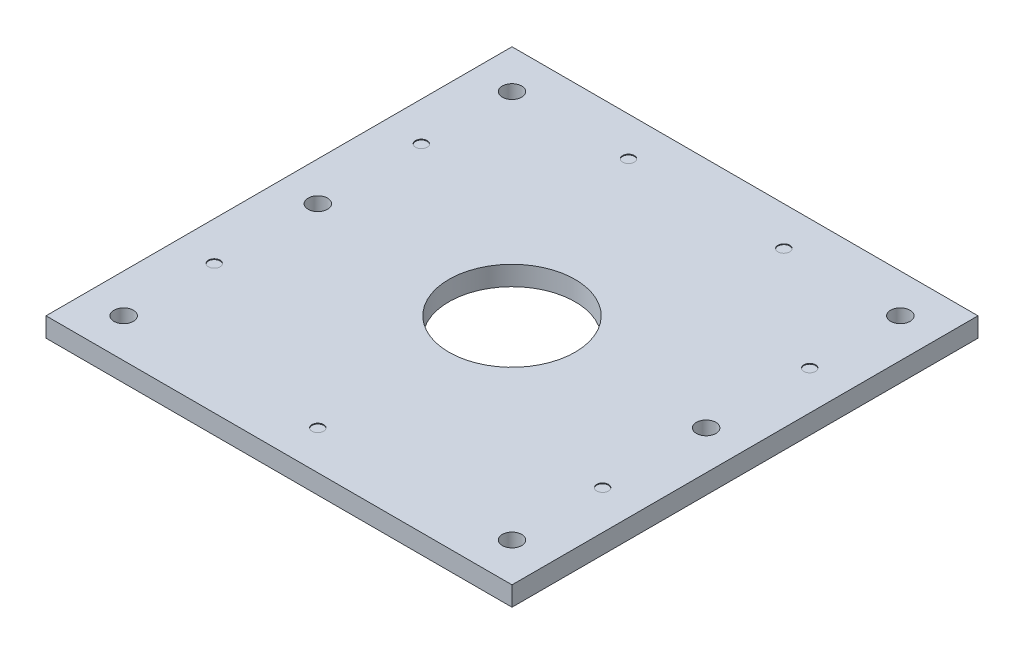
ISO-10303-21;
HEADER;
FILE_DESCRIPTION(('STEP AP214'),'2;1');
FILE_NAME('part.step','',(''),(''),'','','');
FILE_SCHEMA(('AUTOMOTIVE_DESIGN { 1 0 10303 214 1 1 1 1 }'));
ENDSEC;
DATA;
#1=APPLICATION_CONTEXT('core data for automotive mechanical design processes');
#2=APPLICATION_PROTOCOL_DEFINITION('international standard','automotive_design',2000,#1);
#3=PRODUCT_CONTEXT('',#1,'mechanical');
#4=PRODUCT('Part','Part','',(#3));
#5=PRODUCT_RELATED_PRODUCT_CATEGORY('part','',(#4));
#6=PRODUCT_DEFINITION_FORMATION('','',#4);
#7=PRODUCT_DEFINITION_CONTEXT('part definition',#1,'design');
#8=PRODUCT_DEFINITION('design','',#6,#7);
#9=PRODUCT_DEFINITION_SHAPE('','',#8);
#10=(LENGTH_UNIT() NAMED_UNIT(*) SI_UNIT(.MILLI.,.METRE.));
#11=(NAMED_UNIT(*) PLANE_ANGLE_UNIT() SI_UNIT($,.RADIAN.));
#12=(NAMED_UNIT(*) SI_UNIT($,.STERADIAN.) SOLID_ANGLE_UNIT());
#13=UNCERTAINTY_MEASURE_WITH_UNIT(LENGTH_MEASURE(1.E-05),#10,'distance_accuracy_value','');
#14=(GEOMETRIC_REPRESENTATION_CONTEXT(3) GLOBAL_UNCERTAINTY_ASSIGNED_CONTEXT((#13)) GLOBAL_UNIT_ASSIGNED_CONTEXT((#10,
#11,#12)) REPRESENTATION_CONTEXT('',''));
#15=CARTESIAN_POINT('',(0.,0.,0.));
#16=DIRECTION('',(0.,0.,1.));
#17=DIRECTION('',(1.,0.,0.));
#18=AXIS2_PLACEMENT_3D('',#15,#16,#17);
#19=CARTESIAN_POINT('',(-76.2,-3.175,76.2));
#20=DIRECTION('',(1.,0.,0.));
#21=DIRECTION('',(0.,0.,-1.));
#22=AXIS2_PLACEMENT_3D('',#19,#20,#21);
#23=PLANE('',#22);
#24=DIRECTION('',(0.,-1.,0.));
#25=VECTOR('',#24,1.);
#26=CARTESIAN_POINT('',(-76.2,-3.175,-76.2));
#27=LINE('',#26,#25);
#28=CARTESIAN_POINT('',(-76.2,3.175,-76.2));
#29=VERTEX_POINT('',#28);
#30=CARTESIAN_POINT('',(-76.2,-3.175,-76.2));
#31=VERTEX_POINT('',#30);
#32=EDGE_CURVE('E103',#29,#31,#27,.T.);
#33=ORIENTED_EDGE('',*,*,#32,.T.);
#34=DIRECTION('',(0.,0.,-1.));
#35=VECTOR('',#34,1.);
#36=CARTESIAN_POINT('',(-76.2,-3.175,76.2));
#37=LINE('',#36,#35);
#38=CARTESIAN_POINT('',(-76.2,-3.175,76.2));
#39=VERTEX_POINT('',#38);
#40=EDGE_CURVE('E11',#39,#31,#37,.T.);
#41=ORIENTED_EDGE('',*,*,#40,.F.);
#42=DIRECTION('',(0.,-1.,0.));
#43=VECTOR('',#42,1.);
#44=CARTESIAN_POINT('',(-76.2,-3.175,76.2));
#45=LINE('',#44,#43);
#46=CARTESIAN_POINT('',(-76.2,3.175,76.2));
#47=VERTEX_POINT('',#46);
#48=EDGE_CURVE('E91',#47,#39,#45,.T.);
#49=ORIENTED_EDGE('',*,*,#48,.F.);
#50=DIRECTION('',(0.,0.,-1.));
#51=VECTOR('',#50,1.);
#52=CARTESIAN_POINT('',(-76.2,3.175,76.2));
#53=LINE('',#52,#51);
#54=EDGE_CURVE('E99',#47,#29,#53,.T.);
#55=ORIENTED_EDGE('',*,*,#54,.T.);
#56=EDGE_LOOP('',(#33,#41,#49,#55));
#57=FACE_BOUND('',#56,.T.);
#58=ADVANCED_FACE('F40',(#57),#23,.F.);
#59=CARTESIAN_POINT('',(76.2,-3.175,76.2));
#60=DIRECTION('',(0.,1.,0.));
#61=DIRECTION('',(0.,0.,1.));
#62=AXIS2_PLACEMENT_3D('',#59,#60,#61);
#63=PLANE('',#62);
#64=CARTESIAN_POINT('',(0.,-3.175,0.));
#65=DIRECTION('',(0.,1.,0.));
#66=DIRECTION('',(0.,0.,1.));
#67=AXIS2_PLACEMENT_3D('',#64,#65,#66);
#68=CIRCLE('',#67,20.6375);
#69=CARTESIAN_POINT('',(0.,-3.175,20.6375));
#70=VERTEX_POINT('',#69);
#71=EDGE_CURVE('E187',#70,#70,#68,.T.);
#72=ORIENTED_EDGE('',*,*,#71,.T.);
#73=EDGE_LOOP('',(#72));
#74=FACE_BOUND('',#73,.T.);
#75=CARTESIAN_POINT('',(63.5,-3.175,-63.5));
#76=DIRECTION('',(0.,1.,0.));
#77=DIRECTION('',(0.,0.,1.));
#78=AXIS2_PLACEMENT_3D('',#75,#76,#77);
#79=CIRCLE('',#78,3.175);
#80=CARTESIAN_POINT('',(63.5,-3.175,-60.325));
#81=VERTEX_POINT('',#80);
#82=EDGE_CURVE('E120',#81,#81,#79,.T.);
#83=ORIENTED_EDGE('',*,*,#82,.T.);
#84=EDGE_LOOP('',(#83));
#85=FACE_BOUND('',#84,.T.);
#86=CARTESIAN_POINT('',(63.5,-3.175,0.));
#87=DIRECTION('',(0.,1.,0.));
#88=DIRECTION('',(0.,0.,1.));
#89=AXIS2_PLACEMENT_3D('',#86,#87,#88);
#90=CIRCLE('',#89,3.175);
#91=CARTESIAN_POINT('',(63.5,-3.175,3.175));
#92=VERTEX_POINT('',#91);
#93=EDGE_CURVE('E139',#92,#92,#90,.T.);
#94=ORIENTED_EDGE('',*,*,#93,.T.);
#95=EDGE_LOOP('',(#94));
#96=FACE_BOUND('',#95,.T.);
#97=CARTESIAN_POINT('',(63.5,-3.175,63.5));
#98=DIRECTION('',(0.,1.,0.));
#99=DIRECTION('',(0.,0.,1.));
#100=AXIS2_PLACEMENT_3D('',#97,#98,#99);
#101=CIRCLE('',#100,3.175);
#102=CARTESIAN_POINT('',(63.5,-3.175,66.675));
#103=VERTEX_POINT('',#102);
#104=EDGE_CURVE('E133',#103,#103,#101,.T.);
#105=ORIENTED_EDGE('',*,*,#104,.T.);
#106=EDGE_LOOP('',(#105));
#107=FACE_BOUND('',#106,.T.);
#108=CARTESIAN_POINT('',(-63.5,-3.175,63.5));
#109=DIRECTION('',(0.,1.,0.));
#110=DIRECTION('',(0.,0.,1.));
#111=AXIS2_PLACEMENT_3D('',#108,#109,#110);
#112=CIRCLE('',#111,3.175);
#113=CARTESIAN_POINT('',(-63.5,-3.175,66.675));
#114=VERTEX_POINT('',#113);
#115=EDGE_CURVE('E126',#114,#114,#112,.T.);
#116=ORIENTED_EDGE('',*,*,#115,.T.);
#117=EDGE_LOOP('',(#116));
#118=FACE_BOUND('',#117,.T.);
#119=CARTESIAN_POINT('',(-63.5,-3.175,0.));
#120=DIRECTION('',(0.,1.,0.));
#121=DIRECTION('',(0.,0.,1.));
#122=AXIS2_PLACEMENT_3D('',#119,#120,#121);
#123=CIRCLE('',#122,3.175);
#124=CARTESIAN_POINT('',(-63.5,-3.175,3.175));
#125=VERTEX_POINT('',#124);
#126=EDGE_CURVE('E127',#125,#125,#123,.T.);
#127=ORIENTED_EDGE('',*,*,#126,.T.);
#128=EDGE_LOOP('',(#127));
#129=FACE_BOUND('',#128,.T.);
#130=CARTESIAN_POINT('',(-63.5,-3.175,-63.5));
#131=DIRECTION('',(0.,1.,0.));
#132=DIRECTION('',(0.,0.,1.));
#133=AXIS2_PLACEMENT_3D('',#130,#131,#132);
#134=CIRCLE('',#133,3.175);
#135=CARTESIAN_POINT('',(-63.5,-3.175,-60.325));
#136=VERTEX_POINT('',#135);
#137=EDGE_CURVE('E106',#136,#136,#134,.T.);
#138=ORIENTED_EDGE('',*,*,#137,.T.);
#139=EDGE_LOOP('',(#138));
#140=FACE_BOUND('',#139,.T.);
#141=DIRECTION('',(1.,0.,0.));
#142=VECTOR('',#141,1.);
#143=CARTESIAN_POINT('',(76.2,-3.175,-76.2));
#144=LINE('',#143,#142);
#145=CARTESIAN_POINT('',(76.2,-3.175,-76.2));
#146=VERTEX_POINT('',#145);
#147=EDGE_CURVE('E95',#31,#146,#144,.T.);
#148=ORIENTED_EDGE('',*,*,#147,.T.);
#149=DIRECTION('',(0.,0.,-1.));
#150=VECTOR('',#149,1.);
#151=CARTESIAN_POINT('',(76.2,-3.175,76.2));
#152=LINE('',#151,#150);
#153=CARTESIAN_POINT('',(76.2,-3.175,76.2));
#154=VERTEX_POINT('',#153);
#155=EDGE_CURVE('E48',#154,#146,#152,.T.);
#156=ORIENTED_EDGE('',*,*,#155,.F.);
#157=DIRECTION('',(1.,0.,0.));
#158=VECTOR('',#157,1.);
#159=CARTESIAN_POINT('',(76.2,-3.175,76.2));
#160=LINE('',#159,#158);
#161=EDGE_CURVE('E86',#39,#154,#160,.T.);
#162=ORIENTED_EDGE('',*,*,#161,.F.);
#163=ORIENTED_EDGE('',*,*,#40,.T.);
#164=EDGE_LOOP('',(#148,#156,#162,#163));
#165=FACE_BOUND('',#164,.T.);
#166=ADVANCED_FACE('F94',(#74,#85,#96,#107,#118,#129,#140,#165),#63,.F.);
#167=CARTESIAN_POINT('',(76.2,3.175,76.2));
#168=DIRECTION('',(-1.,0.,0.));
#169=DIRECTION('',(0.,0.,1.));
#170=AXIS2_PLACEMENT_3D('',#167,#168,#169);
#171=PLANE('',#170);
#172=DIRECTION('',(0.,1.,0.));
#173=VECTOR('',#172,1.);
#174=CARTESIAN_POINT('',(76.2,3.175,-76.2));
#175=LINE('',#174,#173);
#176=CARTESIAN_POINT('',(76.2,3.175,-76.2));
#177=VERTEX_POINT('',#176);
#178=EDGE_CURVE('E73',#146,#177,#175,.T.);
#179=ORIENTED_EDGE('',*,*,#178,.T.);
#180=DIRECTION('',(0.,0.,-1.));
#181=VECTOR('',#180,1.);
#182=CARTESIAN_POINT('',(76.2,3.175,76.2));
#183=LINE('',#182,#181);
#184=CARTESIAN_POINT('',(76.2,3.175,76.2));
#185=VERTEX_POINT('',#184);
#186=EDGE_CURVE('E96',#185,#177,#183,.T.);
#187=ORIENTED_EDGE('',*,*,#186,.F.);
#188=DIRECTION('',(0.,1.,0.));
#189=VECTOR('',#188,1.);
#190=CARTESIAN_POINT('',(76.2,3.175,76.2));
#191=LINE('',#190,#189);
#192=EDGE_CURVE('E89',#154,#185,#191,.T.);
#193=ORIENTED_EDGE('',*,*,#192,.F.);
#194=ORIENTED_EDGE('',*,*,#155,.T.);
#195=EDGE_LOOP('',(#179,#187,#193,#194));
#196=FACE_BOUND('',#195,.T.);
#197=ADVANCED_FACE('F97',(#196),#171,.F.);
#198=CARTESIAN_POINT('',(-76.2,3.175,76.2));
#199=DIRECTION('',(0.,-1.,0.));
#200=DIRECTION('',(0.,0.,-1.));
#201=AXIS2_PLACEMENT_3D('',#198,#199,#200);
#202=PLANE('',#201);
#203=CARTESIAN_POINT('',(0.,3.175,0.));
#204=DIRECTION('',(0.,1.,0.));
#205=DIRECTION('',(0.,0.,1.));
#206=AXIS2_PLACEMENT_3D('',#203,#204,#205);
#207=CIRCLE('',#206,20.6375);
#208=CARTESIAN_POINT('',(0.,3.175,20.6375));
#209=VERTEX_POINT('',#208);
#210=EDGE_CURVE('E195',#209,#209,#207,.T.);
#211=ORIENTED_EDGE('',*,*,#210,.F.);
#212=EDGE_LOOP('',(#211));
#213=FACE_BOUND('',#212,.T.);
#214=CARTESIAN_POINT('',(25.4,3.175,-63.5));
#215=DIRECTION('',(0.,1.,0.));
#216=DIRECTION('',(0.,0.,1.));
#217=AXIS2_PLACEMENT_3D('',#214,#215,#216);
#218=CIRCLE('',#217,1.90500000000001);
#219=CARTESIAN_POINT('',(25.4,3.175,-61.595));
#220=VERTEX_POINT('',#219);
#221=EDGE_CURVE('E178',#220,#220,#218,.T.);
#222=ORIENTED_EDGE('',*,*,#221,.F.);
#223=EDGE_LOOP('',(#222));
#224=FACE_BOUND('',#223,.T.);
#225=CARTESIAN_POINT('',(63.5,3.175,-33.8666666666667));
#226=DIRECTION('',(0.,1.,0.));
#227=DIRECTION('',(0.,0.,1.));
#228=AXIS2_PLACEMENT_3D('',#225,#226,#227);
#229=CIRCLE('',#228,1.90500000000001);
#230=CARTESIAN_POINT('',(63.5,3.175,-31.9616666666667));
#231=VERTEX_POINT('',#230);
#232=EDGE_CURVE('E172',#231,#231,#229,.T.);
#233=ORIENTED_EDGE('',*,*,#232,.F.);
#234=EDGE_LOOP('',(#233));
#235=FACE_BOUND('',#234,.T.);
#236=CARTESIAN_POINT('',(63.5,3.175,33.8666666666667));
#237=DIRECTION('',(0.,1.,0.));
#238=DIRECTION('',(0.,0.,1.));
#239=AXIS2_PLACEMENT_3D('',#236,#237,#238);
#240=CIRCLE('',#239,1.90500000000001);
#241=CARTESIAN_POINT('',(63.5,3.175,35.7716666666667));
#242=VERTEX_POINT('',#241);
#243=EDGE_CURVE('E166',#242,#242,#240,.T.);
#244=ORIENTED_EDGE('',*,*,#243,.F.);
#245=EDGE_LOOP('',(#244));
#246=FACE_BOUND('',#245,.T.);
#247=CARTESIAN_POINT('',(0.,3.175,63.5));
#248=DIRECTION('',(0.,1.,0.));
#249=DIRECTION('',(0.,0.,1.));
#250=AXIS2_PLACEMENT_3D('',#247,#248,#249);
#251=CIRCLE('',#250,1.905);
#252=CARTESIAN_POINT('',(0.,3.175,65.405));
#253=VERTEX_POINT('',#252);
#254=EDGE_CURVE('E159',#253,#253,#251,.T.);
#255=ORIENTED_EDGE('',*,*,#254,.F.);
#256=EDGE_LOOP('',(#255));
#257=FACE_BOUND('',#256,.T.);
#258=CARTESIAN_POINT('',(-63.5,3.175,-33.8666666666667));
#259=DIRECTION('',(0.,1.,0.));
#260=DIRECTION('',(0.,0.,1.));
#261=AXIS2_PLACEMENT_3D('',#258,#259,#260);
#262=CIRCLE('',#261,1.905);
#263=CARTESIAN_POINT('',(-63.5,3.175,-31.9616666666667));
#264=VERTEX_POINT('',#263);
#265=EDGE_CURVE('E183',#264,#264,#262,.T.);
#266=ORIENTED_EDGE('',*,*,#265,.F.);
#267=EDGE_LOOP('',(#266));
#268=FACE_BOUND('',#267,.T.);
#269=CARTESIAN_POINT('',(-63.5,3.175,33.8666666666667));
#270=DIRECTION('',(0.,1.,0.));
#271=DIRECTION('',(0.,0.,1.));
#272=AXIS2_PLACEMENT_3D('',#269,#270,#271);
#273=CIRCLE('',#272,1.90500000000001);
#274=CARTESIAN_POINT('',(-63.5,3.175,35.7716666666667));
#275=VERTEX_POINT('',#274);
#276=EDGE_CURVE('E190',#275,#275,#273,.T.);
#277=ORIENTED_EDGE('',*,*,#276,.F.);
#278=EDGE_LOOP('',(#277));
#279=FACE_BOUND('',#278,.T.);
#280=CARTESIAN_POINT('',(-25.4,3.175,-63.5));
#281=DIRECTION('',(0.,1.,0.));
#282=DIRECTION('',(0.,0.,1.));
#283=AXIS2_PLACEMENT_3D('',#280,#281,#282);
#284=CIRCLE('',#283,1.90500000000001);
#285=CARTESIAN_POINT('',(-25.4,3.175,-61.595));
#286=VERTEX_POINT('',#285);
#287=EDGE_CURVE('E153',#286,#286,#284,.T.);
#288=ORIENTED_EDGE('',*,*,#287,.F.);
#289=EDGE_LOOP('',(#288));
#290=FACE_BOUND('',#289,.T.);
#291=CARTESIAN_POINT('',(63.5,3.175,-63.5));
#292=DIRECTION('',(0.,1.,0.));
#293=DIRECTION('',(0.,0.,1.));
#294=AXIS2_PLACEMENT_3D('',#291,#292,#293);
#295=CIRCLE('',#294,3.175);
#296=CARTESIAN_POINT('',(63.5,3.175,-60.325));
#297=VERTEX_POINT('',#296);
#298=EDGE_CURVE('E142',#297,#297,#295,.T.);
#299=ORIENTED_EDGE('',*,*,#298,.F.);
#300=EDGE_LOOP('',(#299));
#301=FACE_BOUND('',#300,.T.);
#302=CARTESIAN_POINT('',(63.5,3.175,0.));
#303=DIRECTION('',(0.,1.,0.));
#304=DIRECTION('',(0.,0.,1.));
#305=AXIS2_PLACEMENT_3D('',#302,#303,#304);
#306=CIRCLE('',#305,3.175);
#307=CARTESIAN_POINT('',(63.5,3.175,3.175));
#308=VERTEX_POINT('',#307);
#309=EDGE_CURVE('E136',#308,#308,#306,.T.);
#310=ORIENTED_EDGE('',*,*,#309,.F.);
#311=EDGE_LOOP('',(#310));
#312=FACE_BOUND('',#311,.T.);
#313=CARTESIAN_POINT('',(63.5,3.175,63.5));
#314=DIRECTION('',(0.,1.,0.));
#315=DIRECTION('',(0.,0.,1.));
#316=AXIS2_PLACEMENT_3D('',#313,#314,#315);
#317=CIRCLE('',#316,3.175);
#318=CARTESIAN_POINT('',(63.5,3.175,66.675));
#319=VERTEX_POINT('',#318);
#320=EDGE_CURVE('E130',#319,#319,#317,.T.);
#321=ORIENTED_EDGE('',*,*,#320,.F.);
#322=EDGE_LOOP('',(#321));
#323=FACE_BOUND('',#322,.T.);
#324=CARTESIAN_POINT('',(-63.5,3.175,63.5));
#325=DIRECTION('',(0.,1.,0.));
#326=DIRECTION('',(0.,0.,1.));
#327=AXIS2_PLACEMENT_3D('',#324,#325,#326);
#328=CIRCLE('',#327,3.175);
#329=CARTESIAN_POINT('',(-63.5,3.175,66.675));
#330=VERTEX_POINT('',#329);
#331=EDGE_CURVE('E123',#330,#330,#328,.T.);
#332=ORIENTED_EDGE('',*,*,#331,.F.);
#333=EDGE_LOOP('',(#332));
#334=FACE_BOUND('',#333,.T.);
#335=CARTESIAN_POINT('',(-63.5,3.175,0.));
#336=DIRECTION('',(0.,1.,0.));
#337=DIRECTION('',(0.,0.,1.));
#338=AXIS2_PLACEMENT_3D('',#335,#336,#337);
#339=CIRCLE('',#338,3.175);
#340=CARTESIAN_POINT('',(-63.5,3.175,3.175));
#341=VERTEX_POINT('',#340);
#342=EDGE_CURVE('E147',#341,#341,#339,.T.);
#343=ORIENTED_EDGE('',*,*,#342,.F.);
#344=EDGE_LOOP('',(#343));
#345=FACE_BOUND('',#344,.T.);
#346=CARTESIAN_POINT('',(-63.5,3.175,-63.5));
#347=DIRECTION('',(0.,1.,0.));
#348=DIRECTION('',(0.,0.,1.));
#349=AXIS2_PLACEMENT_3D('',#346,#347,#348);
#350=CIRCLE('',#349,3.175);
#351=CARTESIAN_POINT('',(-63.5,3.175,-60.325));
#352=VERTEX_POINT('',#351);
#353=EDGE_CURVE('E117',#352,#352,#350,.T.);
#354=ORIENTED_EDGE('',*,*,#353,.F.);
#355=EDGE_LOOP('',(#354));
#356=FACE_BOUND('',#355,.T.);
#357=DIRECTION('',(-1.,0.,0.));
#358=VECTOR('',#357,1.);
#359=CARTESIAN_POINT('',(-76.2,3.175,-76.2));
#360=LINE('',#359,#358);
#361=EDGE_CURVE('E79',#177,#29,#360,.T.);
#362=ORIENTED_EDGE('',*,*,#361,.T.);
#363=ORIENTED_EDGE('',*,*,#54,.F.);
#364=DIRECTION('',(-1.,0.,0.));
#365=VECTOR('',#364,1.);
#366=CARTESIAN_POINT('',(-76.2,3.175,76.2));
#367=LINE('',#366,#365);
#368=EDGE_CURVE('E56',#185,#47,#367,.T.);
#369=ORIENTED_EDGE('',*,*,#368,.F.);
#370=ORIENTED_EDGE('',*,*,#186,.T.);
#371=EDGE_LOOP('',(#362,#363,#369,#370));
#372=FACE_BOUND('',#371,.T.);
#373=ADVANCED_FACE('F111',(#213,#224,#235,#246,#257,#268,#279,#290,#301,#312,#323,#334,#345,
#356,#372),#202,.F.);
#374=CARTESIAN_POINT('',(0.,0.,76.2));
#375=DIRECTION('',(0.,0.,-1.));
#376=DIRECTION('',(-1.,0.,0.));
#377=AXIS2_PLACEMENT_3D('',#374,#375,#376);
#378=PLANE('',#377);
#379=ORIENTED_EDGE('',*,*,#48,.T.);
#380=ORIENTED_EDGE('',*,*,#161,.T.);
#381=ORIENTED_EDGE('',*,*,#192,.T.);
#382=ORIENTED_EDGE('',*,*,#368,.T.);
#383=EDGE_LOOP('',(#379,#380,#381,#382));
#384=FACE_BOUND('',#383,.T.);
#385=ADVANCED_FACE('F87',(#384),#378,.F.);
#386=CARTESIAN_POINT('',(0.,0.,-76.2));
#387=DIRECTION('',(0.,0.,-1.));
#388=DIRECTION('',(-1.,0.,0.));
#389=AXIS2_PLACEMENT_3D('',#386,#387,#388);
#390=PLANE('',#389);
#391=ORIENTED_EDGE('',*,*,#32,.F.);
#392=ORIENTED_EDGE('',*,*,#361,.F.);
#393=ORIENTED_EDGE('',*,*,#178,.F.);
#394=ORIENTED_EDGE('',*,*,#147,.F.);
#395=EDGE_LOOP('',(#391,#392,#393,#394));
#396=FACE_BOUND('',#395,.T.);
#397=ADVANCED_FACE('F114',(#396),#390,.T.);
#398=CARTESIAN_POINT('',(-63.5,-3.175,-63.5));
#399=DIRECTION('',(0.,1.,0.));
#400=DIRECTION('',(0.,0.,1.));
#401=AXIS2_PLACEMENT_3D('',#398,#399,#400);
#402=CYLINDRICAL_SURFACE('',#401,3.175);
#403=ORIENTED_EDGE('',*,*,#353,.T.);
#404=EDGE_LOOP('',(#403));
#405=FACE_BOUND('',#404,.T.);
#406=ORIENTED_EDGE('',*,*,#137,.F.);
#407=EDGE_LOOP('',(#406));
#408=FACE_BOUND('',#407,.T.);
#409=ADVANCED_FACE('F239',(#405,#408),#402,.F.);
#410=CARTESIAN_POINT('',(-63.5,-3.175,0.));
#411=DIRECTION('',(0.,1.,0.));
#412=DIRECTION('',(0.,0.,1.));
#413=AXIS2_PLACEMENT_3D('',#410,#411,#412);
#414=CYLINDRICAL_SURFACE('',#413,3.175);
#415=ORIENTED_EDGE('',*,*,#126,.F.);
#416=EDGE_LOOP('',(#415));
#417=FACE_BOUND('',#416,.T.);
#418=ORIENTED_EDGE('',*,*,#342,.T.);
#419=EDGE_LOOP('',(#418));
#420=FACE_BOUND('',#419,.T.);
#421=ADVANCED_FACE('F242',(#417,#420),#414,.F.);
#422=CARTESIAN_POINT('',(-63.5,-3.175,63.5));
#423=DIRECTION('',(0.,1.,0.));
#424=DIRECTION('',(0.,0.,1.));
#425=AXIS2_PLACEMENT_3D('',#422,#423,#424);
#426=CYLINDRICAL_SURFACE('',#425,3.175);
#427=ORIENTED_EDGE('',*,*,#115,.F.);
#428=EDGE_LOOP('',(#427));
#429=FACE_BOUND('',#428,.T.);
#430=ORIENTED_EDGE('',*,*,#331,.T.);
#431=EDGE_LOOP('',(#430));
#432=FACE_BOUND('',#431,.T.);
#433=ADVANCED_FACE('F257',(#429,#432),#426,.F.);
#434=CARTESIAN_POINT('',(63.5,-3.175,63.5));
#435=DIRECTION('',(0.,1.,0.));
#436=DIRECTION('',(0.,0.,1.));
#437=AXIS2_PLACEMENT_3D('',#434,#435,#436);
#438=CYLINDRICAL_SURFACE('',#437,3.175);
#439=ORIENTED_EDGE('',*,*,#320,.T.);
#440=EDGE_LOOP('',(#439));
#441=FACE_BOUND('',#440,.T.);
#442=ORIENTED_EDGE('',*,*,#104,.F.);
#443=EDGE_LOOP('',(#442));
#444=FACE_BOUND('',#443,.T.);
#445=ADVANCED_FACE('F260',(#441,#444),#438,.F.);
#446=CARTESIAN_POINT('',(63.5,-3.175,0.));
#447=DIRECTION('',(0.,1.,0.));
#448=DIRECTION('',(0.,0.,1.));
#449=AXIS2_PLACEMENT_3D('',#446,#447,#448);
#450=CYLINDRICAL_SURFACE('',#449,3.175);
#451=ORIENTED_EDGE('',*,*,#93,.F.);
#452=EDGE_LOOP('',(#451));
#453=FACE_BOUND('',#452,.T.);
#454=ORIENTED_EDGE('',*,*,#309,.T.);
#455=EDGE_LOOP('',(#454));
#456=FACE_BOUND('',#455,.T.);
#457=ADVANCED_FACE('F264',(#453,#456),#450,.F.);
#458=CARTESIAN_POINT('',(63.5,-3.175,-63.5));
#459=DIRECTION('',(0.,1.,0.));
#460=DIRECTION('',(0.,0.,1.));
#461=AXIS2_PLACEMENT_3D('',#458,#459,#460);
#462=CYLINDRICAL_SURFACE('',#461,3.175);
#463=ORIENTED_EDGE('',*,*,#82,.F.);
#464=EDGE_LOOP('',(#463));
#465=FACE_BOUND('',#464,.T.);
#466=ORIENTED_EDGE('',*,*,#298,.T.);
#467=EDGE_LOOP('',(#466));
#468=FACE_BOUND('',#467,.T.);
#469=ADVANCED_FACE('F268',(#465,#468),#462,.F.);
#470=CARTESIAN_POINT('',(-25.4,2.921,-63.5));
#471=DIRECTION('',(0.,1.,0.));
#472=DIRECTION('',(0.,0.,1.));
#473=AXIS2_PLACEMENT_3D('',#470,#471,#472);
#474=CYLINDRICAL_SURFACE('',#473,1.90500000000001);
#475=CARTESIAN_POINT('',(-25.4,2.921,-63.5));
#476=DIRECTION('',(0.,1.,0.));
#477=DIRECTION('',(0.,0.,1.));
#478=AXIS2_PLACEMENT_3D('',#475,#476,#477);
#479=CIRCLE('',#478,1.90500000000001);
#480=CARTESIAN_POINT('',(-25.4,2.921,-61.595));
#481=VERTEX_POINT('',#480);
#482=EDGE_CURVE('E150',#481,#481,#479,.T.);
#483=ORIENTED_EDGE('',*,*,#482,.F.);
#484=EDGE_LOOP('',(#483));
#485=FACE_BOUND('',#484,.T.);
#486=ORIENTED_EDGE('',*,*,#287,.T.);
#487=EDGE_LOOP('',(#486));
#488=FACE_BOUND('',#487,.T.);
#489=ADVANCED_FACE('F272',(#485,#488),#474,.F.);
#490=CARTESIAN_POINT('',(-25.4,2.921,-63.5));
#491=DIRECTION('',(0.,1.,0.));
#492=DIRECTION('',(0.,0.,1.));
#493=AXIS2_PLACEMENT_3D('',#490,#491,#492);
#494=PLANE('',#493);
#495=ORIENTED_EDGE('',*,*,#482,.T.);
#496=EDGE_LOOP('',(#495));
#497=FACE_BOUND('',#496,.T.);
#498=ADVANCED_FACE('F279',(#497),#494,.T.);
#499=CARTESIAN_POINT('',(-63.5,2.921,33.8666666666667));
#500=DIRECTION('',(0.,1.,0.));
#501=DIRECTION('',(0.,0.,1.));
#502=AXIS2_PLACEMENT_3D('',#499,#500,#501);
#503=CYLINDRICAL_SURFACE('',#502,1.90500000000001);
#504=CARTESIAN_POINT('',(-63.5,2.921,33.8666666666667));
#505=DIRECTION('',(0.,1.,0.));
#506=DIRECTION('',(0.,0.,1.));
#507=AXIS2_PLACEMENT_3D('',#504,#505,#506);
#508=CIRCLE('',#507,1.90500000000001);
#509=CARTESIAN_POINT('',(-63.5,2.921,35.7716666666667));
#510=VERTEX_POINT('',#509);
#511=EDGE_CURVE('E163',#510,#510,#508,.T.);
#512=ORIENTED_EDGE('',*,*,#511,.F.);
#513=EDGE_LOOP('',(#512));
#514=FACE_BOUND('',#513,.T.);
#515=ORIENTED_EDGE('',*,*,#276,.T.);
#516=EDGE_LOOP('',(#515));
#517=FACE_BOUND('',#516,.T.);
#518=ADVANCED_FACE('F283',(#514,#517),#503,.F.);
#519=CARTESIAN_POINT('',(-63.5,2.921,33.8666666666667));
#520=DIRECTION('',(0.,1.,0.));
#521=DIRECTION('',(0.,0.,1.));
#522=AXIS2_PLACEMENT_3D('',#519,#520,#521);
#523=PLANE('',#522);
#524=ORIENTED_EDGE('',*,*,#511,.T.);
#525=EDGE_LOOP('',(#524));
#526=FACE_BOUND('',#525,.T.);
#527=ADVANCED_FACE('F320',(#526),#523,.T.);
#528=CARTESIAN_POINT('',(-63.5,2.921,-33.8666666666667));
#529=DIRECTION('',(0.,1.,0.));
#530=DIRECTION('',(0.,0.,1.));
#531=AXIS2_PLACEMENT_3D('',#528,#529,#530);
#532=CYLINDRICAL_SURFACE('',#531,1.905);
#533=CARTESIAN_POINT('',(-63.5,2.921,-33.8666666666667));
#534=DIRECTION('',(0.,1.,0.));
#535=DIRECTION('',(0.,0.,1.));
#536=AXIS2_PLACEMENT_3D('',#533,#534,#535);
#537=CIRCLE('',#536,1.905);
#538=CARTESIAN_POINT('',(-63.5,2.921,-31.9616666666667));
#539=VERTEX_POINT('',#538);
#540=EDGE_CURVE('E186',#539,#539,#537,.T.);
#541=ORIENTED_EDGE('',*,*,#540,.F.);
#542=EDGE_LOOP('',(#541));
#543=FACE_BOUND('',#542,.T.);
#544=ORIENTED_EDGE('',*,*,#265,.T.);
#545=EDGE_LOOP('',(#544));
#546=FACE_BOUND('',#545,.T.);
#547=ADVANCED_FACE('F317',(#543,#546),#532,.F.);
#548=CARTESIAN_POINT('',(-63.5,2.921,-33.8666666666667));
#549=DIRECTION('',(0.,1.,0.));
#550=DIRECTION('',(0.,0.,1.));
#551=AXIS2_PLACEMENT_3D('',#548,#549,#550);
#552=PLANE('',#551);
#553=ORIENTED_EDGE('',*,*,#540,.T.);
#554=EDGE_LOOP('',(#553));
#555=FACE_BOUND('',#554,.T.);
#556=ADVANCED_FACE('F289',(#555),#552,.T.);
#557=CARTESIAN_POINT('',(0.,2.921,63.5));
#558=DIRECTION('',(0.,1.,0.));
#559=DIRECTION('',(0.,0.,1.));
#560=AXIS2_PLACEMENT_3D('',#557,#558,#559);
#561=CYLINDRICAL_SURFACE('',#560,1.905);
#562=CARTESIAN_POINT('',(0.,2.921,63.5));
#563=DIRECTION('',(0.,1.,0.));
#564=DIRECTION('',(0.,0.,1.));
#565=AXIS2_PLACEMENT_3D('',#562,#563,#564);
#566=CIRCLE('',#565,1.905);
#567=CARTESIAN_POINT('',(0.,2.921,65.405));
#568=VERTEX_POINT('',#567);
#569=EDGE_CURVE('E162',#568,#568,#566,.T.);
#570=ORIENTED_EDGE('',*,*,#569,.F.);
#571=EDGE_LOOP('',(#570));
#572=FACE_BOUND('',#571,.T.);
#573=ORIENTED_EDGE('',*,*,#254,.T.);
#574=EDGE_LOOP('',(#573));
#575=FACE_BOUND('',#574,.T.);
#576=ADVANCED_FACE('F285',(#572,#575),#561,.F.);
#577=CARTESIAN_POINT('',(0.,2.921,63.5));
#578=DIRECTION('',(0.,1.,0.));
#579=DIRECTION('',(0.,0.,1.));
#580=AXIS2_PLACEMENT_3D('',#577,#578,#579);
#581=PLANE('',#580);
#582=ORIENTED_EDGE('',*,*,#569,.T.);
#583=EDGE_LOOP('',(#582));
#584=FACE_BOUND('',#583,.T.);
#585=ADVANCED_FACE('F288',(#584),#581,.T.);
#586=CARTESIAN_POINT('',(63.5,2.921,33.8666666666667));
#587=DIRECTION('',(0.,1.,0.));
#588=DIRECTION('',(0.,0.,1.));
#589=AXIS2_PLACEMENT_3D('',#586,#587,#588);
#590=CYLINDRICAL_SURFACE('',#589,1.90500000000001);
#591=CARTESIAN_POINT('',(63.5,2.921,33.8666666666667));
#592=DIRECTION('',(0.,1.,0.));
#593=DIRECTION('',(0.,0.,1.));
#594=AXIS2_PLACEMENT_3D('',#591,#592,#593);
#595=CIRCLE('',#594,1.90500000000001);
#596=CARTESIAN_POINT('',(63.5,2.921,35.7716666666667));
#597=VERTEX_POINT('',#596);
#598=EDGE_CURVE('E169',#597,#597,#595,.T.);
#599=ORIENTED_EDGE('',*,*,#598,.F.);
#600=EDGE_LOOP('',(#599));
#601=FACE_BOUND('',#600,.T.);
#602=ORIENTED_EDGE('',*,*,#243,.T.);
#603=EDGE_LOOP('',(#602));
#604=FACE_BOUND('',#603,.T.);
#605=ADVANCED_FACE('F293',(#601,#604),#590,.F.);
#606=CARTESIAN_POINT('',(63.5,2.921,33.8666666666667));
#607=DIRECTION('',(0.,1.,0.));
#608=DIRECTION('',(0.,0.,1.));
#609=AXIS2_PLACEMENT_3D('',#606,#607,#608);
#610=PLANE('',#609);
#611=ORIENTED_EDGE('',*,*,#598,.T.);
#612=EDGE_LOOP('',(#611));
#613=FACE_BOUND('',#612,.T.);
#614=ADVANCED_FACE('F297',(#613),#610,.T.);
#615=CARTESIAN_POINT('',(63.5,2.921,-33.8666666666667));
#616=DIRECTION('',(0.,1.,0.));
#617=DIRECTION('',(0.,0.,1.));
#618=AXIS2_PLACEMENT_3D('',#615,#616,#617);
#619=CYLINDRICAL_SURFACE('',#618,1.90500000000001);
#620=CARTESIAN_POINT('',(63.5,2.921,-33.8666666666667));
#621=DIRECTION('',(0.,1.,0.));
#622=DIRECTION('',(0.,0.,1.));
#623=AXIS2_PLACEMENT_3D('',#620,#621,#622);
#624=CIRCLE('',#623,1.90500000000001);
#625=CARTESIAN_POINT('',(63.5,2.921,-31.9616666666667));
#626=VERTEX_POINT('',#625);
#627=EDGE_CURVE('E175',#626,#626,#624,.T.);
#628=ORIENTED_EDGE('',*,*,#627,.F.);
#629=EDGE_LOOP('',(#628));
#630=FACE_BOUND('',#629,.T.);
#631=ORIENTED_EDGE('',*,*,#232,.T.);
#632=EDGE_LOOP('',(#631));
#633=FACE_BOUND('',#632,.T.);
#634=ADVANCED_FACE('F301',(#630,#633),#619,.F.);
#635=CARTESIAN_POINT('',(63.5,2.921,-33.8666666666667));
#636=DIRECTION('',(0.,1.,0.));
#637=DIRECTION('',(0.,0.,1.));
#638=AXIS2_PLACEMENT_3D('',#635,#636,#637);
#639=PLANE('',#638);
#640=ORIENTED_EDGE('',*,*,#627,.T.);
#641=EDGE_LOOP('',(#640));
#642=FACE_BOUND('',#641,.T.);
#643=ADVANCED_FACE('F305',(#642),#639,.T.);
#644=CARTESIAN_POINT('',(25.4,2.921,-63.5));
#645=DIRECTION('',(0.,1.,0.));
#646=DIRECTION('',(0.,0.,1.));
#647=AXIS2_PLACEMENT_3D('',#644,#645,#646);
#648=CYLINDRICAL_SURFACE('',#647,1.90500000000001);
#649=CARTESIAN_POINT('',(25.4,2.921,-63.5));
#650=DIRECTION('',(0.,1.,0.));
#651=DIRECTION('',(0.,0.,1.));
#652=AXIS2_PLACEMENT_3D('',#649,#650,#651);
#653=CIRCLE('',#652,1.90500000000001);
#654=CARTESIAN_POINT('',(25.4,2.921,-61.595));
#655=VERTEX_POINT('',#654);
#656=EDGE_CURVE('E156',#655,#655,#653,.T.);
#657=ORIENTED_EDGE('',*,*,#656,.F.);
#658=EDGE_LOOP('',(#657));
#659=FACE_BOUND('',#658,.T.);
#660=ORIENTED_EDGE('',*,*,#221,.T.);
#661=EDGE_LOOP('',(#660));
#662=FACE_BOUND('',#661,.T.);
#663=ADVANCED_FACE('F309',(#659,#662),#648,.F.);
#664=CARTESIAN_POINT('',(25.4,2.921,-63.5));
#665=DIRECTION('',(0.,1.,0.));
#666=DIRECTION('',(0.,0.,1.));
#667=AXIS2_PLACEMENT_3D('',#664,#665,#666);
#668=PLANE('',#667);
#669=ORIENTED_EDGE('',*,*,#656,.T.);
#670=EDGE_LOOP('',(#669));
#671=FACE_BOUND('',#670,.T.);
#672=ADVANCED_FACE('F206',(#671),#668,.T.);
#673=CARTESIAN_POINT('',(0.,-3.175,0.));
#674=DIRECTION('',(0.,1.,0.));
#675=DIRECTION('',(0.,0.,1.));
#676=AXIS2_PLACEMENT_3D('',#673,#674,#675);
#677=CYLINDRICAL_SURFACE('',#676,20.6375);
#678=ORIENTED_EDGE('',*,*,#71,.F.);
#679=EDGE_LOOP('',(#678));
#680=FACE_BOUND('',#679,.T.);
#681=ORIENTED_EDGE('',*,*,#210,.T.);
#682=EDGE_LOOP('',(#681));
#683=FACE_BOUND('',#682,.T.);
#684=ADVANCED_FACE('F203',(#680,#683),#677,.F.);
#685=CLOSED_SHELL('',(#58,#166,#197,#373,#385,#397,#409,#421,#433,#445,#457,#469,#489,#498,#518,
#527,#547,#556,#576,#585,#605,#614,#634,#643,#663,#672,#684));
#686=MANIFOLD_SOLID_BREP('B2',#685);
#687=ADVANCED_BREP_SHAPE_REPRESENTATION('',(#18,#686),#14);
#688=SHAPE_DEFINITION_REPRESENTATION(#9,#687);
ENDSEC;
END-ISO-10303-21;
